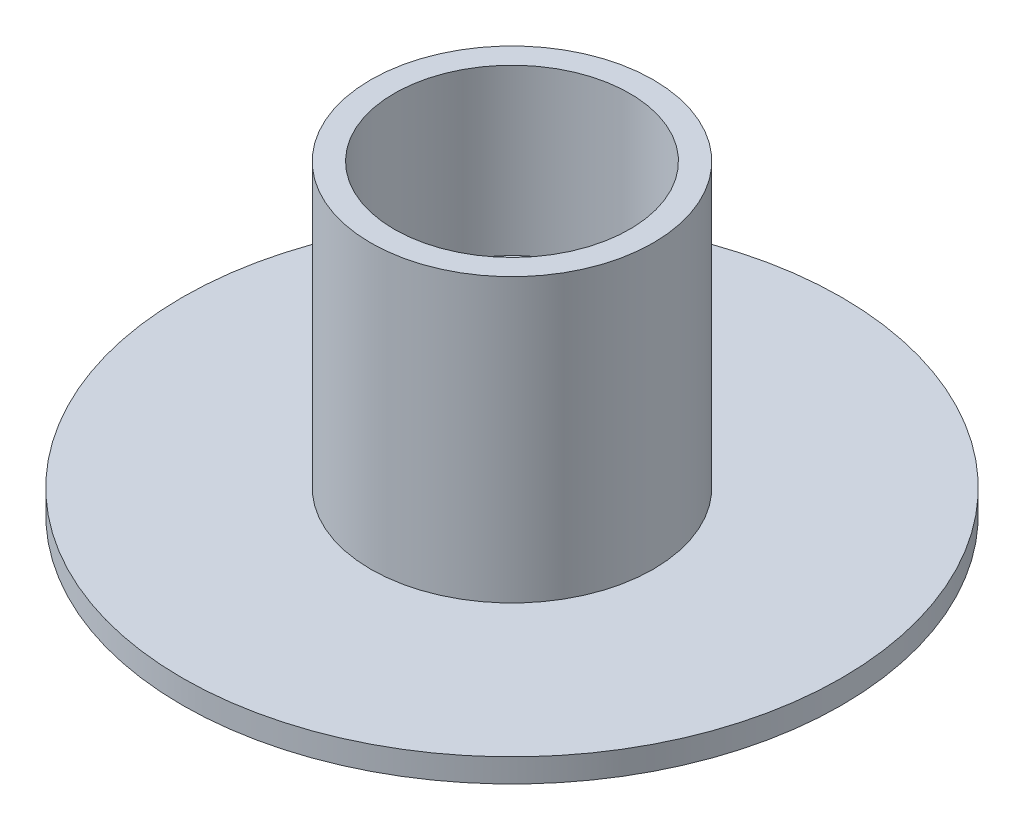
ISO-10303-21;
HEADER;
FILE_DESCRIPTION(('STEP AP214'),'2;1');
FILE_NAME('part.step','',(''),(''),'','','');
FILE_SCHEMA(('AUTOMOTIVE_DESIGN { 1 0 10303 214 1 1 1 1 }'));
ENDSEC;
DATA;
#1=APPLICATION_CONTEXT('core data for automotive mechanical design processes');
#2=APPLICATION_PROTOCOL_DEFINITION('international standard','automotive_design',2000,#1);
#3=PRODUCT_CONTEXT('',#1,'mechanical');
#4=PRODUCT('Part','Part','',(#3));
#5=PRODUCT_RELATED_PRODUCT_CATEGORY('part','',(#4));
#6=PRODUCT_DEFINITION_FORMATION('','',#4);
#7=PRODUCT_DEFINITION_CONTEXT('part definition',#1,'design');
#8=PRODUCT_DEFINITION('design','',#6,#7);
#9=PRODUCT_DEFINITION_SHAPE('','',#8);
#10=(LENGTH_UNIT() NAMED_UNIT(*) SI_UNIT(.MILLI.,.METRE.));
#11=(NAMED_UNIT(*) PLANE_ANGLE_UNIT() SI_UNIT($,.RADIAN.));
#12=(NAMED_UNIT(*) SI_UNIT($,.STERADIAN.) SOLID_ANGLE_UNIT());
#13=UNCERTAINTY_MEASURE_WITH_UNIT(LENGTH_MEASURE(1.E-05),#10,'distance_accuracy_value','');
#14=(GEOMETRIC_REPRESENTATION_CONTEXT(3) GLOBAL_UNCERTAINTY_ASSIGNED_CONTEXT((#13)) GLOBAL_UNIT_ASSIGNED_CONTEXT((#10,
#11,#12)) REPRESENTATION_CONTEXT('',''));
#15=CARTESIAN_POINT('',(0.,0.,0.));
#16=DIRECTION('',(0.,0.,1.));
#17=DIRECTION('',(1.,0.,0.));
#18=AXIS2_PLACEMENT_3D('',#15,#16,#17);
#19=CARTESIAN_POINT('',(0.,5.,0.));
#20=DIRECTION('',(0.,-1.,0.));
#21=DIRECTION('',(0.,0.,-1.));
#22=AXIS2_PLACEMENT_3D('',#19,#20,#21);
#23=CYLINDRICAL_SURFACE('',#22,70.);
#24=CARTESIAN_POINT('',(0.,5.,0.));
#25=DIRECTION('',(0.,1.,0.));
#26=DIRECTION('',(0.,0.,1.));
#27=AXIS2_PLACEMENT_3D('',#24,#25,#26);
#28=CIRCLE('',#27,70.);
#29=CARTESIAN_POINT('',(0.,5.,70.));
#30=VERTEX_POINT('',#29);
#31=EDGE_CURVE('E40',#30,#30,#28,.T.);
#32=ORIENTED_EDGE('',*,*,#31,.F.);
#33=EDGE_LOOP('',(#32));
#34=FACE_BOUND('',#33,.T.);
#35=CARTESIAN_POINT('',(0.,0.,0.));
#36=DIRECTION('',(0.,1.,0.));
#37=DIRECTION('',(0.,0.,1.));
#38=AXIS2_PLACEMENT_3D('',#35,#36,#37);
#39=CIRCLE('',#38,70.);
#40=CARTESIAN_POINT('',(0.,0.,70.));
#41=VERTEX_POINT('',#40);
#42=EDGE_CURVE('E36',#41,#41,#39,.T.);
#43=ORIENTED_EDGE('',*,*,#42,.T.);
#44=EDGE_LOOP('',(#43));
#45=FACE_BOUND('',#44,.T.);
#46=ADVANCED_FACE('F33',(#34,#45),#23,.T.);
#47=CARTESIAN_POINT('',(0.,5.,0.));
#48=DIRECTION('',(0.,1.,0.));
#49=DIRECTION('',(0.,0.,1.));
#50=AXIS2_PLACEMENT_3D('',#47,#48,#49);
#51=PLANE('',#50);
#52=CARTESIAN_POINT('',(0.,5.,0.));
#53=DIRECTION('',(0.,1.,0.));
#54=DIRECTION('',(0.,0.,1.));
#55=AXIS2_PLACEMENT_3D('',#52,#53,#54);
#56=CIRCLE('',#55,30.);
#57=CARTESIAN_POINT('',(0.,5.,30.));
#58=VERTEX_POINT('',#57);
#59=EDGE_CURVE('E10',#58,#58,#56,.T.);
#60=ORIENTED_EDGE('',*,*,#59,.F.);
#61=EDGE_LOOP('',(#60));
#62=FACE_BOUND('',#61,.T.);
#63=ORIENTED_EDGE('',*,*,#31,.T.);
#64=EDGE_LOOP('',(#63));
#65=FACE_BOUND('',#64,.T.);
#66=ADVANCED_FACE('F85',(#62,#65),#51,.T.);
#67=CARTESIAN_POINT('',(0.,0.,0.));
#68=DIRECTION('',(0.,1.,0.));
#69=DIRECTION('',(0.,0.,1.));
#70=AXIS2_PLACEMENT_3D('',#67,#68,#69);
#71=PLANE('',#70);
#72=CARTESIAN_POINT('',(0.,0.,0.));
#73=DIRECTION('',(0.,-1.,0.));
#74=DIRECTION('',(0.,0.,-1.));
#75=AXIS2_PLACEMENT_3D('',#72,#73,#74);
#76=CIRCLE('',#75,5.25);
#77=CARTESIAN_POINT('',(0.,0.,-5.25));
#78=VERTEX_POINT('',#77);
#79=EDGE_CURVE('E50',#78,#78,#76,.T.);
#80=ORIENTED_EDGE('',*,*,#79,.F.);
#81=EDGE_LOOP('',(#80));
#82=FACE_BOUND('',#81,.T.);
#83=ORIENTED_EDGE('',*,*,#42,.F.);
#84=EDGE_LOOP('',(#83));
#85=FACE_BOUND('',#84,.T.);
#86=ADVANCED_FACE('F80',(#82,#85),#71,.F.);
#87=CARTESIAN_POINT('',(0.,65.,0.));
#88=DIRECTION('',(0.,-1.,0.));
#89=DIRECTION('',(0.,0.,-1.));
#90=AXIS2_PLACEMENT_3D('',#87,#88,#89);
#91=CYLINDRICAL_SURFACE('',#90,30.);
#92=CARTESIAN_POINT('',(0.,65.,0.));
#93=DIRECTION('',(0.,1.,0.));
#94=DIRECTION('',(0.,0.,1.));
#95=AXIS2_PLACEMENT_3D('',#92,#93,#94);
#96=CIRCLE('',#95,30.);
#97=CARTESIAN_POINT('',(0.,65.,30.));
#98=VERTEX_POINT('',#97);
#99=EDGE_CURVE('E46',#98,#98,#96,.T.);
#100=ORIENTED_EDGE('',*,*,#99,.F.);
#101=EDGE_LOOP('',(#100));
#102=FACE_BOUND('',#101,.T.);
#103=ORIENTED_EDGE('',*,*,#59,.T.);
#104=EDGE_LOOP('',(#103));
#105=FACE_BOUND('',#104,.T.);
#106=ADVANCED_FACE('F75',(#102,#105),#91,.T.);
#107=CARTESIAN_POINT('',(0.,65.,0.));
#108=DIRECTION('',(0.,1.,0.));
#109=DIRECTION('',(0.,0.,1.));
#110=AXIS2_PLACEMENT_3D('',#107,#108,#109);
#111=PLANE('',#110);
#112=CARTESIAN_POINT('',(0.,65.,0.));
#113=DIRECTION('',(0.,1.,0.));
#114=DIRECTION('',(0.,0.,1.));
#115=AXIS2_PLACEMENT_3D('',#112,#113,#114);
#116=CIRCLE('',#115,25.);
#117=CARTESIAN_POINT('',(0.,65.,25.));
#118=VERTEX_POINT('',#117);
#119=EDGE_CURVE('E56',#118,#118,#116,.T.);
#120=ORIENTED_EDGE('',*,*,#119,.F.);
#121=EDGE_LOOP('',(#120));
#122=FACE_BOUND('',#121,.T.);
#123=ORIENTED_EDGE('',*,*,#99,.T.);
#124=EDGE_LOOP('',(#123));
#125=FACE_BOUND('',#124,.T.);
#126=ADVANCED_FACE('F71',(#122,#125),#111,.T.);
#127=CARTESIAN_POINT('',(0.,10.,0.));
#128=DIRECTION('',(0.,-1.,0.));
#129=DIRECTION('',(0.,0.,-1.));
#130=AXIS2_PLACEMENT_3D('',#127,#128,#129);
#131=CYLINDRICAL_SURFACE('',#130,5.25);
#132=CARTESIAN_POINT('',(0.,10.,0.));
#133=DIRECTION('',(0.,-1.,0.));
#134=DIRECTION('',(0.,0.,-1.));
#135=AXIS2_PLACEMENT_3D('',#132,#133,#134);
#136=CIRCLE('',#135,5.25);
#137=CARTESIAN_POINT('',(0.,10.,-5.25));
#138=VERTEX_POINT('',#137);
#139=EDGE_CURVE('E49',#138,#138,#136,.T.);
#140=ORIENTED_EDGE('',*,*,#139,.F.);
#141=EDGE_LOOP('',(#140));
#142=FACE_BOUND('',#141,.T.);
#143=ORIENTED_EDGE('',*,*,#79,.T.);
#144=EDGE_LOOP('',(#143));
#145=FACE_BOUND('',#144,.T.);
#146=ADVANCED_FACE('F74',(#142,#145),#131,.F.);
#147=CARTESIAN_POINT('',(0.,10.,0.));
#148=DIRECTION('',(0.,-1.,0.));
#149=DIRECTION('',(0.,0.,-1.));
#150=AXIS2_PLACEMENT_3D('',#147,#148,#149);
#151=PLANE('',#150);
#152=ORIENTED_EDGE('',*,*,#139,.T.);
#153=EDGE_LOOP('',(#152));
#154=FACE_BOUND('',#153,.T.);
#155=ADVANCED_FACE('F67',(#154),#151,.T.);
#156=CARTESIAN_POINT('',(0.,30.,0.));
#157=DIRECTION('',(0.,1.,0.));
#158=DIRECTION('',(0.,0.,1.));
#159=AXIS2_PLACEMENT_3D('',#156,#157,#158);
#160=CYLINDRICAL_SURFACE('',#159,25.);
#161=CARTESIAN_POINT('',(0.,30.,0.));
#162=DIRECTION('',(0.,1.,0.));
#163=DIRECTION('',(0.,0.,1.));
#164=AXIS2_PLACEMENT_3D('',#161,#162,#163);
#165=CIRCLE('',#164,25.);
#166=CARTESIAN_POINT('',(0.,30.,25.));
#167=VERTEX_POINT('',#166);
#168=EDGE_CURVE('E53',#167,#167,#165,.T.);
#169=ORIENTED_EDGE('',*,*,#168,.F.);
#170=EDGE_LOOP('',(#169));
#171=FACE_BOUND('',#170,.T.);
#172=ORIENTED_EDGE('',*,*,#119,.T.);
#173=EDGE_LOOP('',(#172));
#174=FACE_BOUND('',#173,.T.);
#175=ADVANCED_FACE('F64',(#171,#174),#160,.F.);
#176=CARTESIAN_POINT('',(0.,30.,0.));
#177=DIRECTION('',(0.,1.,0.));
#178=DIRECTION('',(0.,0.,1.));
#179=AXIS2_PLACEMENT_3D('',#176,#177,#178);
#180=PLANE('',#179);
#181=ORIENTED_EDGE('',*,*,#168,.T.);
#182=EDGE_LOOP('',(#181));
#183=FACE_BOUND('',#182,.T.);
#184=ADVANCED_FACE('F62',(#183),#180,.T.);
#185=CLOSED_SHELL('',(#46,#66,#86,#106,#126,#146,#155,#175,#184));
#186=MANIFOLD_SOLID_BREP('B2',#185);
#187=ADVANCED_BREP_SHAPE_REPRESENTATION('',(#18,#186),#14);
#188=SHAPE_DEFINITION_REPRESENTATION(#9,#187);
ENDSEC;
END-ISO-10303-21;
